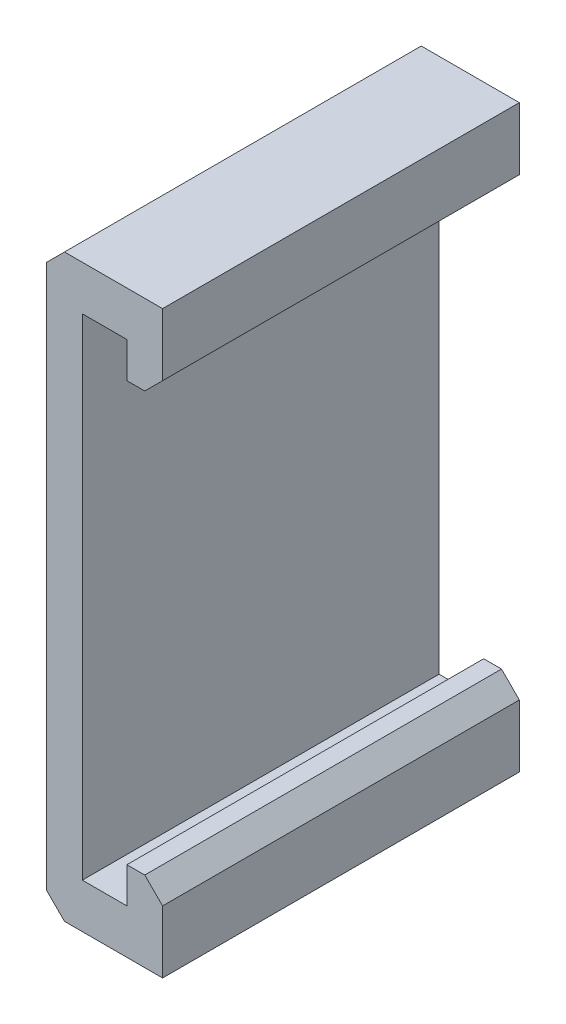
ISO-10303-21;
HEADER;
FILE_DESCRIPTION(('STEP AP214'),'2;1');
FILE_NAME('part.step','',(''),(''),'','','');
FILE_SCHEMA(('AUTOMOTIVE_DESIGN { 1 0 10303 214 1 1 1 1 }'));
ENDSEC;
DATA;
#1=APPLICATION_CONTEXT('core data for automotive mechanical design processes');
#2=APPLICATION_PROTOCOL_DEFINITION('international standard','automotive_design',2000,#1);
#3=PRODUCT_CONTEXT('',#1,'mechanical');
#4=PRODUCT('Part','Part','',(#3));
#5=PRODUCT_RELATED_PRODUCT_CATEGORY('part','',(#4));
#6=PRODUCT_DEFINITION_FORMATION('','',#4);
#7=PRODUCT_DEFINITION_CONTEXT('part definition',#1,'design');
#8=PRODUCT_DEFINITION('design','',#6,#7);
#9=PRODUCT_DEFINITION_SHAPE('','',#8);
#10=(LENGTH_UNIT() NAMED_UNIT(*) SI_UNIT(.MILLI.,.METRE.));
#11=(NAMED_UNIT(*) PLANE_ANGLE_UNIT() SI_UNIT($,.RADIAN.));
#12=(NAMED_UNIT(*) SI_UNIT($,.STERADIAN.) SOLID_ANGLE_UNIT());
#13=UNCERTAINTY_MEASURE_WITH_UNIT(LENGTH_MEASURE(1.E-05),#10,'distance_accuracy_value','');
#14=(GEOMETRIC_REPRESENTATION_CONTEXT(3) GLOBAL_UNCERTAINTY_ASSIGNED_CONTEXT((#13)) GLOBAL_UNIT_ASSIGNED_CONTEXT((#10,
#11,#12)) REPRESENTATION_CONTEXT('',''));
#15=CARTESIAN_POINT('',(0.,0.,0.));
#16=DIRECTION('',(0.,0.,1.));
#17=DIRECTION('',(1.,0.,0.));
#18=AXIS2_PLACEMENT_3D('',#15,#16,#17);
#19=CARTESIAN_POINT('',(1.8,21.2,-8.));
#20=DIRECTION('',(0.,-1.,0.));
#21=DIRECTION('',(0.,0.,-1.));
#22=AXIS2_PLACEMENT_3D('',#19,#20,#21);
#23=PLANE('',#22);
#24=DIRECTION('',(1.,0.,0.));
#25=VECTOR('',#24,1.);
#26=CARTESIAN_POINT('',(1.8,21.2,0.));
#27=LINE('',#26,#25);
#28=CARTESIAN_POINT('',(1.8,21.2,0.));
#29=VERTEX_POINT('',#28);
#30=CARTESIAN_POINT('',(2.2,21.2,0.));
#31=VERTEX_POINT('',#30);
#32=EDGE_CURVE('E198',#29,#31,#27,.T.);
#33=ORIENTED_EDGE('',*,*,#32,.F.);
#34=DIRECTION('',(0.,0.,1.));
#35=VECTOR('',#34,1.);
#36=CARTESIAN_POINT('',(1.8,21.2,-8.));
#37=LINE('',#36,#35);
#38=CARTESIAN_POINT('',(1.8,21.2,-8.));
#39=VERTEX_POINT('',#38);
#40=EDGE_CURVE('E11',#39,#29,#37,.T.);
#41=ORIENTED_EDGE('',*,*,#40,.F.);
#42=DIRECTION('',(1.,0.,0.));
#43=VECTOR('',#42,1.);
#44=CARTESIAN_POINT('',(1.8,21.2,-8.));
#45=LINE('',#44,#43);
#46=CARTESIAN_POINT('',(2.2,21.2,-8.));
#47=VERTEX_POINT('',#46);
#48=EDGE_CURVE('E258',#39,#47,#45,.T.);
#49=ORIENTED_EDGE('',*,*,#48,.T.);
#50=DIRECTION('',(0.,0.,1.));
#51=VECTOR('',#50,1.);
#52=CARTESIAN_POINT('',(2.2,21.2,-8.));
#53=LINE('',#52,#51);
#54=EDGE_CURVE('E48',#47,#31,#53,.T.);
#55=ORIENTED_EDGE('',*,*,#54,.T.);
#56=EDGE_LOOP('',(#33,#41,#49,#55));
#57=FACE_BOUND('',#56,.T.);
#58=ADVANCED_FACE('F44',(#57),#23,.T.);
#59=CARTESIAN_POINT('',(1.8,22.,-8.));
#60=DIRECTION('',(-1.,0.,0.));
#61=DIRECTION('',(0.,0.,1.));
#62=AXIS2_PLACEMENT_3D('',#59,#60,#61);
#63=PLANE('',#62);
#64=DIRECTION('',(0.,-1.,0.));
#65=VECTOR('',#64,1.);
#66=CARTESIAN_POINT('',(1.8,22.,0.));
#67=LINE('',#66,#65);
#68=CARTESIAN_POINT('',(1.8,22.,0.));
#69=VERTEX_POINT('',#68);
#70=EDGE_CURVE('E251',#69,#29,#67,.T.);
#71=ORIENTED_EDGE('',*,*,#70,.F.);
#72=DIRECTION('',(0.,0.,1.));
#73=VECTOR('',#72,1.);
#74=CARTESIAN_POINT('',(1.8,22.,-8.));
#75=LINE('',#74,#73);
#76=CARTESIAN_POINT('',(1.8,22.,-8.));
#77=VERTEX_POINT('',#76);
#78=EDGE_CURVE('E54',#77,#69,#75,.T.);
#79=ORIENTED_EDGE('',*,*,#78,.F.);
#80=DIRECTION('',(0.,-1.,0.));
#81=VECTOR('',#80,1.);
#82=CARTESIAN_POINT('',(1.8,22.,-8.));
#83=LINE('',#82,#81);
#84=EDGE_CURVE('E185',#77,#39,#83,.T.);
#85=ORIENTED_EDGE('',*,*,#84,.T.);
#86=ORIENTED_EDGE('',*,*,#40,.T.);
#87=EDGE_LOOP('',(#71,#79,#85,#86));
#88=FACE_BOUND('',#87,.T.);
#89=ADVANCED_FACE('F299',(#88),#63,.T.);
#90=CARTESIAN_POINT('',(0.8,22.,-8.));
#91=DIRECTION('',(0.,-1.,0.));
#92=DIRECTION('',(0.,0.,-1.));
#93=AXIS2_PLACEMENT_3D('',#90,#91,#92);
#94=PLANE('',#93);
#95=DIRECTION('',(1.,0.,0.));
#96=VECTOR('',#95,1.);
#97=CARTESIAN_POINT('',(0.8,22.,0.));
#98=LINE('',#97,#96);
#99=CARTESIAN_POINT('',(0.8,22.,0.));
#100=VERTEX_POINT('',#99);
#101=EDGE_CURVE('E169',#100,#69,#98,.T.);
#102=ORIENTED_EDGE('',*,*,#101,.F.);
#103=DIRECTION('',(0.,0.,1.));
#104=VECTOR('',#103,1.);
#105=CARTESIAN_POINT('',(0.8,22.,-8.));
#106=LINE('',#105,#104);
#107=CARTESIAN_POINT('',(0.8,22.,-8.));
#108=VERTEX_POINT('',#107);
#109=EDGE_CURVE('E162',#108,#100,#106,.T.);
#110=ORIENTED_EDGE('',*,*,#109,.F.);
#111=DIRECTION('',(1.,0.,0.));
#112=VECTOR('',#111,1.);
#113=CARTESIAN_POINT('',(0.8,22.,-8.));
#114=LINE('',#113,#112);
#115=EDGE_CURVE('E167',#108,#77,#114,.T.);
#116=ORIENTED_EDGE('',*,*,#115,.T.);
#117=ORIENTED_EDGE('',*,*,#78,.T.);
#118=EDGE_LOOP('',(#102,#110,#116,#117));
#119=FACE_BOUND('',#118,.T.);
#120=ADVANCED_FACE('F164',(#119),#94,.T.);
#121=CARTESIAN_POINT('',(0.8,11.,-8.));
#122=DIRECTION('',(1.,0.,0.));
#123=DIRECTION('',(0.,0.,-1.));
#124=AXIS2_PLACEMENT_3D('',#121,#122,#123);
#125=PLANE('',#124);
#126=DIRECTION('',(0.,1.,0.));
#127=VECTOR('',#126,1.);
#128=CARTESIAN_POINT('',(0.8,11.,0.));
#129=LINE('',#128,#127);
#130=CARTESIAN_POINT('',(0.8,11.,0.));
#131=VERTEX_POINT('',#130);
#132=EDGE_CURVE('E249',#131,#100,#129,.T.);
#133=ORIENTED_EDGE('',*,*,#132,.F.);
#134=DIRECTION('',(0.,0.,1.));
#135=VECTOR('',#134,1.);
#136=CARTESIAN_POINT('',(0.8,11.,-8.));
#137=LINE('',#136,#135);
#138=CARTESIAN_POINT('',(0.8,11.,-8.));
#139=VERTEX_POINT('',#138);
#140=EDGE_CURVE('E171',#139,#131,#137,.T.);
#141=ORIENTED_EDGE('',*,*,#140,.F.);
#142=DIRECTION('',(0.,1.,0.));
#143=VECTOR('',#142,1.);
#144=CARTESIAN_POINT('',(0.8,11.,-8.));
#145=LINE('',#144,#143);
#146=EDGE_CURVE('E180',#139,#108,#145,.T.);
#147=ORIENTED_EDGE('',*,*,#146,.T.);
#148=ORIENTED_EDGE('',*,*,#109,.T.);
#149=EDGE_LOOP('',(#133,#141,#147,#148));
#150=FACE_BOUND('',#149,.T.);
#151=ADVANCED_FACE('F183',(#150),#125,.T.);
#152=CARTESIAN_POINT('',(1.8,11.,-8.));
#153=DIRECTION('',(0.,1.,0.));
#154=DIRECTION('',(0.,0.,1.));
#155=AXIS2_PLACEMENT_3D('',#152,#153,#154);
#156=PLANE('',#155);
#157=DIRECTION('',(-1.,0.,0.));
#158=VECTOR('',#157,1.);
#159=CARTESIAN_POINT('',(1.8,11.,0.));
#160=LINE('',#159,#158);
#161=CARTESIAN_POINT('',(1.8,11.,0.));
#162=VERTEX_POINT('',#161);
#163=EDGE_CURVE('E241',#162,#131,#160,.T.);
#164=ORIENTED_EDGE('',*,*,#163,.F.);
#165=DIRECTION('',(0.,0.,1.));
#166=VECTOR('',#165,1.);
#167=CARTESIAN_POINT('',(1.8,11.,-8.));
#168=LINE('',#167,#166);
#169=CARTESIAN_POINT('',(1.8,11.,-8.));
#170=VERTEX_POINT('',#169);
#171=EDGE_CURVE('E265',#170,#162,#168,.T.);
#172=ORIENTED_EDGE('',*,*,#171,.F.);
#173=DIRECTION('',(-1.,0.,0.));
#174=VECTOR('',#173,1.);
#175=CARTESIAN_POINT('',(1.8,11.,-8.));
#176=LINE('',#175,#174);
#177=EDGE_CURVE('E190',#170,#139,#176,.T.);
#178=ORIENTED_EDGE('',*,*,#177,.T.);
#179=ORIENTED_EDGE('',*,*,#140,.T.);
#180=EDGE_LOOP('',(#164,#172,#178,#179));
#181=FACE_BOUND('',#180,.T.);
#182=ADVANCED_FACE('F313',(#181),#156,.T.);
#183=CARTESIAN_POINT('',(1.8,11.8,-8.));
#184=DIRECTION('',(-1.,0.,0.));
#185=DIRECTION('',(0.,0.,1.));
#186=AXIS2_PLACEMENT_3D('',#183,#184,#185);
#187=PLANE('',#186);
#188=DIRECTION('',(0.,-1.,0.));
#189=VECTOR('',#188,1.);
#190=CARTESIAN_POINT('',(1.8,11.8,0.));
#191=LINE('',#190,#189);
#192=CARTESIAN_POINT('',(1.8,11.8,0.));
#193=VERTEX_POINT('',#192);
#194=EDGE_CURVE('E238',#193,#162,#191,.T.);
#195=ORIENTED_EDGE('',*,*,#194,.F.);
#196=DIRECTION('',(0.,0.,1.));
#197=VECTOR('',#196,1.);
#198=CARTESIAN_POINT('',(1.8,11.8,-8.));
#199=LINE('',#198,#197);
#200=CARTESIAN_POINT('',(1.8,11.8,-8.));
#201=VERTEX_POINT('',#200);
#202=EDGE_CURVE('E264',#201,#193,#199,.T.);
#203=ORIENTED_EDGE('',*,*,#202,.F.);
#204=DIRECTION('',(0.,-1.,0.));
#205=VECTOR('',#204,1.);
#206=CARTESIAN_POINT('',(1.8,11.8,-8.));
#207=LINE('',#206,#205);
#208=EDGE_CURVE('E188',#201,#170,#207,.T.);
#209=ORIENTED_EDGE('',*,*,#208,.T.);
#210=ORIENTED_EDGE('',*,*,#171,.T.);
#211=EDGE_LOOP('',(#195,#203,#209,#210));
#212=FACE_BOUND('',#211,.T.);
#213=ADVANCED_FACE('F314',(#212),#187,.T.);
#214=CARTESIAN_POINT('',(2.2,11.8,-8.));
#215=DIRECTION('',(0.,1.,0.));
#216=DIRECTION('',(0.,0.,1.));
#217=AXIS2_PLACEMENT_3D('',#214,#215,#216);
#218=PLANE('',#217);
#219=DIRECTION('',(-1.,0.,0.));
#220=VECTOR('',#219,1.);
#221=CARTESIAN_POINT('',(2.2,11.8,0.));
#222=LINE('',#221,#220);
#223=CARTESIAN_POINT('',(2.2,11.8,0.));
#224=VERTEX_POINT('',#223);
#225=EDGE_CURVE('E237',#224,#193,#222,.T.);
#226=ORIENTED_EDGE('',*,*,#225,.F.);
#227=DIRECTION('',(0.,0.,1.));
#228=VECTOR('',#227,1.);
#229=CARTESIAN_POINT('',(2.2,11.8,-8.));
#230=LINE('',#229,#228);
#231=CARTESIAN_POINT('',(2.2,11.8,-8.));
#232=VERTEX_POINT('',#231);
#233=EDGE_CURVE('E268',#232,#224,#230,.T.);
#234=ORIENTED_EDGE('',*,*,#233,.F.);
#235=DIRECTION('',(-1.,0.,0.));
#236=VECTOR('',#235,1.);
#237=CARTESIAN_POINT('',(2.2,11.8,-8.));
#238=LINE('',#237,#236);
#239=EDGE_CURVE('E494',#232,#201,#238,.T.);
#240=ORIENTED_EDGE('',*,*,#239,.T.);
#241=ORIENTED_EDGE('',*,*,#202,.T.);
#242=EDGE_LOOP('',(#226,#234,#240,#241));
#243=FACE_BOUND('',#242,.T.);
#244=ADVANCED_FACE('F318',(#243),#218,.T.);
#245=CARTESIAN_POINT('',(2.6,11.4,-8.));
#246=DIRECTION('',(0.707106781186547,0.707106781186548,0.));
#247=DIRECTION('',(-0.707106781186548,0.707106781186547,0.));
#248=AXIS2_PLACEMENT_3D('',#245,#246,#247);
#249=PLANE('',#248);
#250=DIRECTION('',(-0.707106781186548,0.707106781186547,0.));
#251=VECTOR('',#250,1.);
#252=CARTESIAN_POINT('',(2.6,11.4,0.));
#253=LINE('',#252,#251);
#254=CARTESIAN_POINT('',(2.6,11.4,0.));
#255=VERTEX_POINT('',#254);
#256=EDGE_CURVE('E232',#255,#224,#253,.T.);
#257=ORIENTED_EDGE('',*,*,#256,.F.);
#258=DIRECTION('',(0.,0.,1.));
#259=VECTOR('',#258,1.);
#260=CARTESIAN_POINT('',(2.6,11.4,-8.));
#261=LINE('',#260,#259);
#262=CARTESIAN_POINT('',(2.6,11.4,-8.));
#263=VERTEX_POINT('',#262);
#264=EDGE_CURVE('E271',#263,#255,#261,.T.);
#265=ORIENTED_EDGE('',*,*,#264,.F.);
#266=DIRECTION('',(-0.707106781186548,0.707106781186547,0.));
#267=VECTOR('',#266,1.);
#268=CARTESIAN_POINT('',(2.6,11.4,-8.));
#269=LINE('',#268,#267);
#270=EDGE_CURVE('E491',#263,#232,#269,.T.);
#271=ORIENTED_EDGE('',*,*,#270,.T.);
#272=ORIENTED_EDGE('',*,*,#233,.T.);
#273=EDGE_LOOP('',(#257,#265,#271,#272));
#274=FACE_BOUND('',#273,.T.);
#275=ADVANCED_FACE('F325',(#274),#249,.T.);
#276=CARTESIAN_POINT('',(2.6,10.,-8.));
#277=DIRECTION('',(1.,0.,0.));
#278=DIRECTION('',(0.,0.,-1.));
#279=AXIS2_PLACEMENT_3D('',#276,#277,#278);
#280=PLANE('',#279);
#281=DIRECTION('',(0.,1.,0.));
#282=VECTOR('',#281,1.);
#283=CARTESIAN_POINT('',(2.6,10.,0.));
#284=LINE('',#283,#282);
#285=CARTESIAN_POINT('',(2.6,10.,0.));
#286=VERTEX_POINT('',#285);
#287=EDGE_CURVE('E229',#286,#255,#284,.T.);
#288=ORIENTED_EDGE('',*,*,#287,.F.);
#289=DIRECTION('',(0.,0.,1.));
#290=VECTOR('',#289,1.);
#291=CARTESIAN_POINT('',(2.6,10.,-8.));
#292=LINE('',#291,#290);
#293=CARTESIAN_POINT('',(2.6,10.,-8.));
#294=VERTEX_POINT('',#293);
#295=EDGE_CURVE('E273',#294,#286,#292,.T.);
#296=ORIENTED_EDGE('',*,*,#295,.F.);
#297=DIRECTION('',(0.,1.,0.));
#298=VECTOR('',#297,1.);
#299=CARTESIAN_POINT('',(2.6,10.,-8.));
#300=LINE('',#299,#298);
#301=EDGE_CURVE('E503',#294,#263,#300,.T.);
#302=ORIENTED_EDGE('',*,*,#301,.T.);
#303=ORIENTED_EDGE('',*,*,#264,.T.);
#304=EDGE_LOOP('',(#288,#296,#302,#303));
#305=FACE_BOUND('',#304,.T.);
#306=ADVANCED_FACE('F326',(#305),#280,.T.);
#307=CARTESIAN_POINT('',(0.4,10.,-8.));
#308=DIRECTION('',(0.,-1.,0.));
#309=DIRECTION('',(0.,0.,-1.));
#310=AXIS2_PLACEMENT_3D('',#307,#308,#309);
#311=PLANE('',#310);
#312=DIRECTION('',(1.,0.,0.));
#313=VECTOR('',#312,1.);
#314=CARTESIAN_POINT('',(0.4,10.,0.));
#315=LINE('',#314,#313);
#316=CARTESIAN_POINT('',(0.4,10.,0.));
#317=VERTEX_POINT('',#316);
#318=EDGE_CURVE('E221',#317,#286,#315,.T.);
#319=ORIENTED_EDGE('',*,*,#318,.F.);
#320=DIRECTION('',(0.,0.,1.));
#321=VECTOR('',#320,1.);
#322=CARTESIAN_POINT('',(0.4,10.,-8.));
#323=LINE('',#322,#321);
#324=CARTESIAN_POINT('',(0.4,10.,-8.));
#325=VERTEX_POINT('',#324);
#326=EDGE_CURVE('E280',#325,#317,#323,.T.);
#327=ORIENTED_EDGE('',*,*,#326,.F.);
#328=DIRECTION('',(1.,0.,0.));
#329=VECTOR('',#328,1.);
#330=CARTESIAN_POINT('',(0.4,10.,-8.));
#331=LINE('',#330,#329);
#332=EDGE_CURVE('E482',#325,#294,#331,.T.);
#333=ORIENTED_EDGE('',*,*,#332,.T.);
#334=ORIENTED_EDGE('',*,*,#295,.T.);
#335=EDGE_LOOP('',(#319,#327,#333,#334));
#336=FACE_BOUND('',#335,.T.);
#337=ADVANCED_FACE('F329',(#336),#311,.T.);
#338=CARTESIAN_POINT('',(0.,10.4,-8.));
#339=DIRECTION('',(-0.707106781186547,-0.707106781186548,0.));
#340=DIRECTION('',(0.707106781186548,-0.707106781186547,0.));
#341=AXIS2_PLACEMENT_3D('',#338,#339,#340);
#342=PLANE('',#341);
#343=DIRECTION('',(0.707106781186548,-0.707106781186547,0.));
#344=VECTOR('',#343,1.);
#345=CARTESIAN_POINT('',(0.,10.4,0.));
#346=LINE('',#345,#344);
#347=CARTESIAN_POINT('',(0.,10.4,0.));
#348=VERTEX_POINT('',#347);
#349=EDGE_CURVE('E219',#348,#317,#346,.T.);
#350=ORIENTED_EDGE('',*,*,#349,.F.);
#351=DIRECTION('',(0.,0.,1.));
#352=VECTOR('',#351,1.);
#353=CARTESIAN_POINT('',(0.,10.4,-8.));
#354=LINE('',#353,#352);
#355=CARTESIAN_POINT('',(0.,10.4,-8.));
#356=VERTEX_POINT('',#355);
#357=EDGE_CURVE('E278',#356,#348,#354,.T.);
#358=ORIENTED_EDGE('',*,*,#357,.F.);
#359=DIRECTION('',(0.707106781186548,-0.707106781186547,0.));
#360=VECTOR('',#359,1.);
#361=CARTESIAN_POINT('',(0.,10.4,-8.));
#362=LINE('',#361,#360);
#363=EDGE_CURVE('E477',#356,#325,#362,.T.);
#364=ORIENTED_EDGE('',*,*,#363,.T.);
#365=ORIENTED_EDGE('',*,*,#326,.T.);
#366=EDGE_LOOP('',(#350,#358,#364,#365));
#367=FACE_BOUND('',#366,.T.);
#368=ADVANCED_FACE('F331',(#367),#342,.T.);
#369=CARTESIAN_POINT('',(0.,22.6,-8.));
#370=DIRECTION('',(-1.,0.,0.));
#371=DIRECTION('',(0.,-1.,0.));
#372=AXIS2_PLACEMENT_3D('',#369,#370,#371);
#373=PLANE('',#372);
#374=DIRECTION('',(0.,-1.,0.));
#375=VECTOR('',#374,1.);
#376=CARTESIAN_POINT('',(0.,22.6,0.));
#377=LINE('',#376,#375);
#378=CARTESIAN_POINT('',(0.,22.6,0.));
#379=VERTEX_POINT('',#378);
#380=EDGE_CURVE('E216',#379,#348,#377,.T.);
#381=ORIENTED_EDGE('',*,*,#380,.F.);
#382=DIRECTION('',(0.,0.,1.));
#383=VECTOR('',#382,1.);
#384=CARTESIAN_POINT('',(0.,22.6,-8.));
#385=LINE('',#384,#383);
#386=CARTESIAN_POINT('',(0.,22.6,-8.));
#387=VERTEX_POINT('',#386);
#388=EDGE_CURVE('E284',#387,#379,#385,.T.);
#389=ORIENTED_EDGE('',*,*,#388,.F.);
#390=DIRECTION('',(0.,-1.,0.));
#391=VECTOR('',#390,1.);
#392=CARTESIAN_POINT('',(0.,22.6,-8.));
#393=LINE('',#392,#391);
#394=EDGE_CURVE('E515',#387,#356,#393,.T.);
#395=ORIENTED_EDGE('',*,*,#394,.T.);
#396=ORIENTED_EDGE('',*,*,#357,.T.);
#397=EDGE_LOOP('',(#381,#389,#395,#396));
#398=FACE_BOUND('',#397,.T.);
#399=ADVANCED_FACE('F339',(#398),#373,.T.);
#400=CARTESIAN_POINT('',(0.4,23.,-8.));
#401=DIRECTION('',(-0.707106781186549,0.707106781186546,0.));
#402=DIRECTION('',(-0.707106781186546,-0.707106781186549,0.));
#403=AXIS2_PLACEMENT_3D('',#400,#401,#402);
#404=PLANE('',#403);
#405=DIRECTION('',(-0.707106781186546,-0.707106781186549,0.));
#406=VECTOR('',#405,1.);
#407=CARTESIAN_POINT('',(0.4,23.,0.));
#408=LINE('',#407,#406);
#409=CARTESIAN_POINT('',(0.4,23.,0.));
#410=VERTEX_POINT('',#409);
#411=EDGE_CURVE('E215',#410,#379,#408,.T.);
#412=ORIENTED_EDGE('',*,*,#411,.F.);
#413=DIRECTION('',(0.,0.,1.));
#414=VECTOR('',#413,1.);
#415=CARTESIAN_POINT('',(0.4,23.,-8.));
#416=LINE('',#415,#414);
#417=CARTESIAN_POINT('',(0.4,23.,-8.));
#418=VERTEX_POINT('',#417);
#419=EDGE_CURVE('E286',#418,#410,#416,.T.);
#420=ORIENTED_EDGE('',*,*,#419,.F.);
#421=DIRECTION('',(-0.707106781186546,-0.707106781186549,0.));
#422=VECTOR('',#421,1.);
#423=CARTESIAN_POINT('',(0.4,23.,-8.));
#424=LINE('',#423,#422);
#425=EDGE_CURVE('E471',#418,#387,#424,.T.);
#426=ORIENTED_EDGE('',*,*,#425,.T.);
#427=ORIENTED_EDGE('',*,*,#388,.T.);
#428=EDGE_LOOP('',(#412,#420,#426,#427));
#429=FACE_BOUND('',#428,.T.);
#430=ADVANCED_FACE('F342',(#429),#404,.T.);
#431=CARTESIAN_POINT('',(2.6,23.,-8.));
#432=DIRECTION('',(0.,1.,0.));
#433=DIRECTION('',(0.,0.,1.));
#434=AXIS2_PLACEMENT_3D('',#431,#432,#433);
#435=PLANE('',#434);
#436=DIRECTION('',(-1.,0.,0.));
#437=VECTOR('',#436,1.);
#438=CARTESIAN_POINT('',(2.6,23.,0.));
#439=LINE('',#438,#437);
#440=CARTESIAN_POINT('',(2.6,23.,0.));
#441=VERTEX_POINT('',#440);
#442=EDGE_CURVE('E208',#441,#410,#439,.T.);
#443=ORIENTED_EDGE('',*,*,#442,.F.);
#444=DIRECTION('',(0.,0.,1.));
#445=VECTOR('',#444,1.);
#446=CARTESIAN_POINT('',(2.6,23.,-8.));
#447=LINE('',#446,#445);
#448=CARTESIAN_POINT('',(2.6,23.,-8.));
#449=VERTEX_POINT('',#448);
#450=EDGE_CURVE('E288',#449,#441,#447,.T.);
#451=ORIENTED_EDGE('',*,*,#450,.F.);
#452=DIRECTION('',(-1.,0.,0.));
#453=VECTOR('',#452,1.);
#454=CARTESIAN_POINT('',(2.6,23.,-8.));
#455=LINE('',#454,#453);
#456=EDGE_CURVE('E468',#449,#418,#455,.T.);
#457=ORIENTED_EDGE('',*,*,#456,.T.);
#458=ORIENTED_EDGE('',*,*,#419,.T.);
#459=EDGE_LOOP('',(#443,#451,#457,#458));
#460=FACE_BOUND('',#459,.T.);
#461=ADVANCED_FACE('F347',(#460),#435,.T.);
#462=CARTESIAN_POINT('',(2.6,21.6,-8.));
#463=DIRECTION('',(1.,0.,0.));
#464=DIRECTION('',(0.,0.,-1.));
#465=AXIS2_PLACEMENT_3D('',#462,#463,#464);
#466=PLANE('',#465);
#467=DIRECTION('',(0.,1.,0.));
#468=VECTOR('',#467,1.);
#469=CARTESIAN_POINT('',(2.6,21.6,0.));
#470=LINE('',#469,#468);
#471=CARTESIAN_POINT('',(2.6,21.6,0.));
#472=VERTEX_POINT('',#471);
#473=EDGE_CURVE('E204',#472,#441,#470,.T.);
#474=ORIENTED_EDGE('',*,*,#473,.F.);
#475=DIRECTION('',(0.,0.,1.));
#476=VECTOR('',#475,1.);
#477=CARTESIAN_POINT('',(2.6,21.6,-8.));
#478=LINE('',#477,#476);
#479=CARTESIAN_POINT('',(2.6,21.6,-8.));
#480=VERTEX_POINT('',#479);
#481=EDGE_CURVE('E292',#480,#472,#478,.T.);
#482=ORIENTED_EDGE('',*,*,#481,.F.);
#483=DIRECTION('',(0.,1.,0.));
#484=VECTOR('',#483,1.);
#485=CARTESIAN_POINT('',(2.6,21.6,-8.));
#486=LINE('',#485,#484);
#487=EDGE_CURVE('E516',#480,#449,#486,.T.);
#488=ORIENTED_EDGE('',*,*,#487,.T.);
#489=ORIENTED_EDGE('',*,*,#450,.T.);
#490=EDGE_LOOP('',(#474,#482,#488,#489));
#491=FACE_BOUND('',#490,.T.);
#492=ADVANCED_FACE('F348',(#491),#466,.T.);
#493=CARTESIAN_POINT('',(2.2,21.2,-8.));
#494=DIRECTION('',(0.707106781186549,-0.707106781186546,0.));
#495=DIRECTION('',(0.707106781186546,0.707106781186549,0.));
#496=AXIS2_PLACEMENT_3D('',#493,#494,#495);
#497=PLANE('',#496);
#498=DIRECTION('',(0.707106781186546,0.707106781186549,0.));
#499=VECTOR('',#498,1.);
#500=CARTESIAN_POINT('',(2.2,21.2,0.));
#501=LINE('',#500,#499);
#502=EDGE_CURVE('E199',#31,#472,#501,.T.);
#503=ORIENTED_EDGE('',*,*,#502,.F.);
#504=ORIENTED_EDGE('',*,*,#54,.F.);
#505=DIRECTION('',(0.707106781186546,0.707106781186549,0.));
#506=VECTOR('',#505,1.);
#507=CARTESIAN_POINT('',(2.2,21.2,-8.));
#508=LINE('',#507,#506);
#509=EDGE_CURVE('E522',#47,#480,#508,.T.);
#510=ORIENTED_EDGE('',*,*,#509,.T.);
#511=ORIENTED_EDGE('',*,*,#481,.T.);
#512=EDGE_LOOP('',(#503,#504,#510,#511));
#513=FACE_BOUND('',#512,.T.);
#514=ADVANCED_FACE('F293',(#513),#497,.T.);
#515=CARTESIAN_POINT('',(0.,0.,-8.));
#516=DIRECTION('',(0.,0.,1.));
#517=DIRECTION('',(1.,0.,0.));
#518=AXIS2_PLACEMENT_3D('',#515,#516,#517);
#519=PLANE('',#518);
#520=ORIENTED_EDGE('',*,*,#48,.F.);
#521=ORIENTED_EDGE('',*,*,#84,.F.);
#522=ORIENTED_EDGE('',*,*,#115,.F.);
#523=ORIENTED_EDGE('',*,*,#146,.F.);
#524=ORIENTED_EDGE('',*,*,#177,.F.);
#525=ORIENTED_EDGE('',*,*,#208,.F.);
#526=ORIENTED_EDGE('',*,*,#239,.F.);
#527=ORIENTED_EDGE('',*,*,#270,.F.);
#528=ORIENTED_EDGE('',*,*,#301,.F.);
#529=ORIENTED_EDGE('',*,*,#332,.F.);
#530=ORIENTED_EDGE('',*,*,#363,.F.);
#531=ORIENTED_EDGE('',*,*,#394,.F.);
#532=ORIENTED_EDGE('',*,*,#425,.F.);
#533=ORIENTED_EDGE('',*,*,#456,.F.);
#534=ORIENTED_EDGE('',*,*,#487,.F.);
#535=ORIENTED_EDGE('',*,*,#509,.F.);
#536=EDGE_LOOP('',(#520,#521,#522,#523,#524,#525,#526,#527,#528,#529,#530,#531,#532,#533,#534,#535));
#537=FACE_BOUND('',#536,.T.);
#538=ADVANCED_FACE('F179',(#537),#519,.F.);
#539=CARTESIAN_POINT('',(0.,0.,0.));
#540=DIRECTION('',(0.,0.,1.));
#541=DIRECTION('',(1.,0.,0.));
#542=AXIS2_PLACEMENT_3D('',#539,#540,#541);
#543=PLANE('',#542);
#544=ORIENTED_EDGE('',*,*,#32,.T.);
#545=ORIENTED_EDGE('',*,*,#502,.T.);
#546=ORIENTED_EDGE('',*,*,#473,.T.);
#547=ORIENTED_EDGE('',*,*,#442,.T.);
#548=ORIENTED_EDGE('',*,*,#411,.T.);
#549=ORIENTED_EDGE('',*,*,#380,.T.);
#550=ORIENTED_EDGE('',*,*,#349,.T.);
#551=ORIENTED_EDGE('',*,*,#318,.T.);
#552=ORIENTED_EDGE('',*,*,#287,.T.);
#553=ORIENTED_EDGE('',*,*,#256,.T.);
#554=ORIENTED_EDGE('',*,*,#225,.T.);
#555=ORIENTED_EDGE('',*,*,#194,.T.);
#556=ORIENTED_EDGE('',*,*,#163,.T.);
#557=ORIENTED_EDGE('',*,*,#132,.T.);
#558=ORIENTED_EDGE('',*,*,#101,.T.);
#559=ORIENTED_EDGE('',*,*,#70,.T.);
#560=EDGE_LOOP('',(#544,#545,#546,#547,#548,#549,#550,#551,#552,#553,#554,#555,#556,#557,#558,#559));
#561=FACE_BOUND('',#560,.T.);
#562=ADVANCED_FACE('F300',(#561),#543,.T.);
#563=CLOSED_SHELL('',(#58,#89,#120,#151,#182,#213,#244,#275,#306,#337,#368,#399,#430,#461,#492,
#514,#538,#562));
#564=MANIFOLD_SOLID_BREP('B2',#563);
#565=ADVANCED_BREP_SHAPE_REPRESENTATION('',(#18,#564),#14);
#566=SHAPE_DEFINITION_REPRESENTATION(#9,#565);
ENDSEC;
END-ISO-10303-21;
